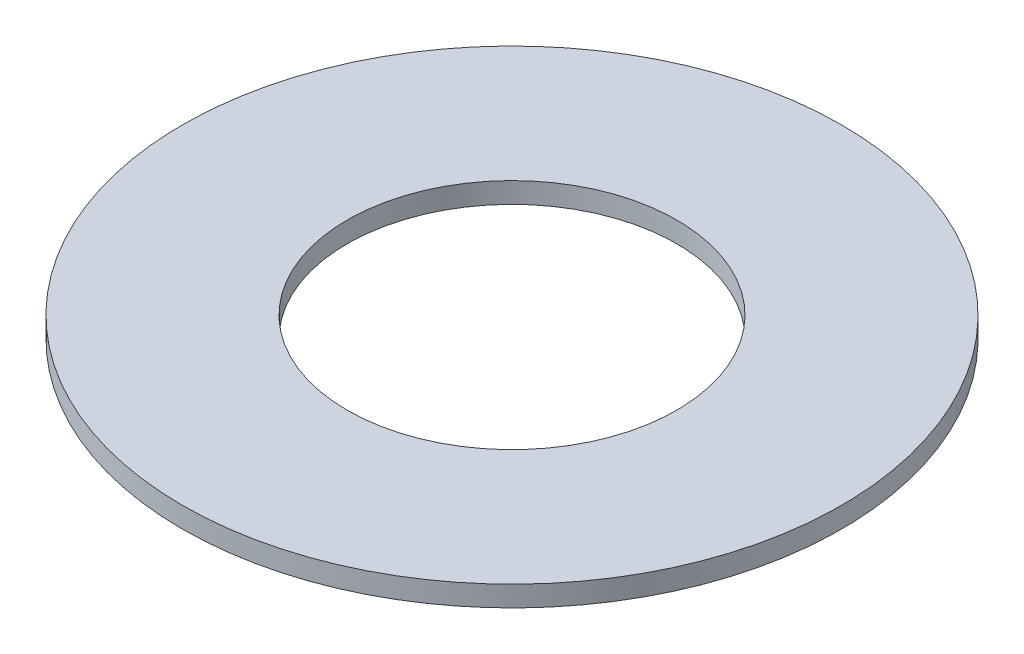
ISO-10303-21;
HEADER;
FILE_DESCRIPTION(('STEP AP214'),'2;1');
FILE_NAME('part.step','',(''),(''),'','','');
FILE_SCHEMA(('AUTOMOTIVE_DESIGN { 1 0 10303 214 1 1 1 1 }'));
ENDSEC;
DATA;
#1=APPLICATION_CONTEXT('core data for automotive mechanical design processes');
#2=APPLICATION_PROTOCOL_DEFINITION('international standard','automotive_design',2000,#1);
#3=PRODUCT_CONTEXT('',#1,'mechanical');
#4=PRODUCT('Part','Part','',(#3));
#5=PRODUCT_RELATED_PRODUCT_CATEGORY('part','',(#4));
#6=PRODUCT_DEFINITION_FORMATION('','',#4);
#7=PRODUCT_DEFINITION_CONTEXT('part definition',#1,'design');
#8=PRODUCT_DEFINITION('design','',#6,#7);
#9=PRODUCT_DEFINITION_SHAPE('','',#8);
#10=(LENGTH_UNIT() NAMED_UNIT(*) SI_UNIT(.MILLI.,.METRE.));
#11=(NAMED_UNIT(*) PLANE_ANGLE_UNIT() SI_UNIT($,.RADIAN.));
#12=(NAMED_UNIT(*) SI_UNIT($,.STERADIAN.) SOLID_ANGLE_UNIT());
#13=UNCERTAINTY_MEASURE_WITH_UNIT(LENGTH_MEASURE(1.E-05),#10,'distance_accuracy_value','');
#14=(GEOMETRIC_REPRESENTATION_CONTEXT(3) GLOBAL_UNCERTAINTY_ASSIGNED_CONTEXT((#13)) GLOBAL_UNIT_ASSIGNED_CONTEXT((#10,
#11,#12)) REPRESENTATION_CONTEXT('',''));
#15=CARTESIAN_POINT('',(0.,0.,0.));
#16=DIRECTION('',(0.,0.,1.));
#17=DIRECTION('',(1.,0.,0.));
#18=AXIS2_PLACEMENT_3D('',#15,#16,#17);
#19=CARTESIAN_POINT('',(0.,0.79375,0.));
#20=DIRECTION('',(0.,1.,0.));
#21=DIRECTION('',(0.,0.,1.));
#22=AXIS2_PLACEMENT_3D('',#19,#20,#21);
#23=PLANE('',#22);
#24=CARTESIAN_POINT('',(0.,0.79375,0.));
#25=DIRECTION('',(0.,1.,0.));
#26=DIRECTION('',(0.,0.,1.));
#27=AXIS2_PLACEMENT_3D('',#24,#25,#26);
#28=CIRCLE('',#27,12.7);
#29=CARTESIAN_POINT('',(0.,0.79375,12.7));
#30=VERTEX_POINT('',#29);
#31=EDGE_CURVE('E10',#30,#30,#28,.T.);
#32=ORIENTED_EDGE('',*,*,#31,.T.);
#33=EDGE_LOOP('',(#32));
#34=FACE_BOUND('',#33,.T.);
#35=CARTESIAN_POINT('',(0.,0.79375,0.));
#36=DIRECTION('',(0.,1.,0.));
#37=DIRECTION('',(0.,0.,1.));
#38=AXIS2_PLACEMENT_3D('',#35,#36,#37);
#39=CIRCLE('',#38,6.35);
#40=CARTESIAN_POINT('',(0.,0.79375,6.35));
#41=VERTEX_POINT('',#40);
#42=EDGE_CURVE('E41',#41,#41,#39,.T.);
#43=ORIENTED_EDGE('',*,*,#42,.F.);
#44=EDGE_LOOP('',(#43));
#45=FACE_BOUND('',#44,.T.);
#46=ADVANCED_FACE('F30',(#34,#45),#23,.T.);
#47=CARTESIAN_POINT('',(0.,0.,0.));
#48=DIRECTION('',(0.,1.,0.));
#49=DIRECTION('',(0.,0.,1.));
#50=AXIS2_PLACEMENT_3D('',#47,#48,#49);
#51=PLANE('',#50);
#52=CARTESIAN_POINT('',(0.,0.,0.));
#53=DIRECTION('',(0.,1.,0.));
#54=DIRECTION('',(0.,0.,1.));
#55=AXIS2_PLACEMENT_3D('',#52,#53,#54);
#56=CIRCLE('',#55,12.7);
#57=CARTESIAN_POINT('',(0.,0.,12.7));
#58=VERTEX_POINT('',#57);
#59=EDGE_CURVE('E34',#58,#58,#56,.T.);
#60=ORIENTED_EDGE('',*,*,#59,.F.);
#61=EDGE_LOOP('',(#60));
#62=FACE_BOUND('',#61,.T.);
#63=CARTESIAN_POINT('',(0.,0.,0.));
#64=DIRECTION('',(0.,1.,0.));
#65=DIRECTION('',(0.,0.,1.));
#66=AXIS2_PLACEMENT_3D('',#63,#64,#65);
#67=CIRCLE('',#66,6.35);
#68=CARTESIAN_POINT('',(0.,0.,6.35));
#69=VERTEX_POINT('',#68);
#70=EDGE_CURVE('E43',#69,#69,#67,.T.);
#71=ORIENTED_EDGE('',*,*,#70,.T.);
#72=EDGE_LOOP('',(#71));
#73=FACE_BOUND('',#72,.T.);
#74=ADVANCED_FACE('F53',(#62,#73),#51,.F.);
#75=CARTESIAN_POINT('',(0.,0.79375,0.));
#76=DIRECTION('',(0.,-1.,0.));
#77=DIRECTION('',(0.,0.,-1.));
#78=AXIS2_PLACEMENT_3D('',#75,#76,#77);
#79=CYLINDRICAL_SURFACE('',#78,12.7);
#80=ORIENTED_EDGE('',*,*,#31,.F.);
#81=EDGE_LOOP('',(#80));
#82=FACE_BOUND('',#81,.T.);
#83=ORIENTED_EDGE('',*,*,#59,.T.);
#84=EDGE_LOOP('',(#83));
#85=FACE_BOUND('',#84,.T.);
#86=ADVANCED_FACE('F32',(#82,#85),#79,.T.);
#87=CARTESIAN_POINT('',(0.,0.79375,0.));
#88=DIRECTION('',(0.,-1.,0.));
#89=DIRECTION('',(0.,0.,-1.));
#90=AXIS2_PLACEMENT_3D('',#87,#88,#89);
#91=CYLINDRICAL_SURFACE('',#90,6.35);
#92=ORIENTED_EDGE('',*,*,#42,.T.);
#93=EDGE_LOOP('',(#92));
#94=FACE_BOUND('',#93,.T.);
#95=ORIENTED_EDGE('',*,*,#70,.F.);
#96=EDGE_LOOP('',(#95));
#97=FACE_BOUND('',#96,.T.);
#98=ADVANCED_FACE('F49',(#94,#97),#91,.F.);
#99=CLOSED_SHELL('',(#46,#74,#86,#98));
#100=MANIFOLD_SOLID_BREP('B2',#99);
#101=ADVANCED_BREP_SHAPE_REPRESENTATION('',(#18,#100),#14);
#102=SHAPE_DEFINITION_REPRESENTATION(#9,#101);
ENDSEC;
END-ISO-10303-21;
